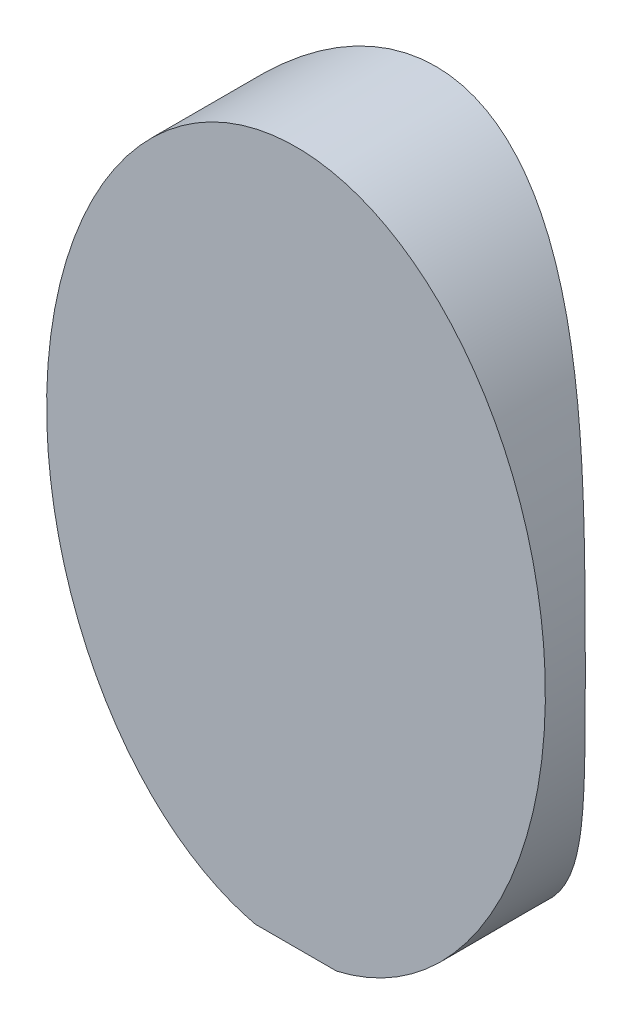
ISO-10303-21;
HEADER;
FILE_DESCRIPTION(('STEP AP214'),'2;1');
FILE_NAME('part.step','',(''),(''),'','','');
FILE_SCHEMA(('AUTOMOTIVE_DESIGN { 1 0 10303 214 1 1 1 1 }'));
ENDSEC;
DATA;
#1=APPLICATION_CONTEXT('core data for automotive mechanical design processes');
#2=APPLICATION_PROTOCOL_DEFINITION('international standard','automotive_design',2000,#1);
#3=PRODUCT_CONTEXT('',#1,'mechanical');
#4=PRODUCT('Part','Part','',(#3));
#5=PRODUCT_RELATED_PRODUCT_CATEGORY('part','',(#4));
#6=PRODUCT_DEFINITION_FORMATION('','',#4);
#7=PRODUCT_DEFINITION_CONTEXT('part definition',#1,'design');
#8=PRODUCT_DEFINITION('design','',#6,#7);
#9=PRODUCT_DEFINITION_SHAPE('','',#8);
#10=(LENGTH_UNIT() NAMED_UNIT(*) SI_UNIT(.MILLI.,.METRE.));
#11=(NAMED_UNIT(*) PLANE_ANGLE_UNIT() SI_UNIT($,.RADIAN.));
#12=(NAMED_UNIT(*) SI_UNIT($,.STERADIAN.) SOLID_ANGLE_UNIT());
#13=UNCERTAINTY_MEASURE_WITH_UNIT(LENGTH_MEASURE(1.E-05),#10,'distance_accuracy_value','');
#14=(GEOMETRIC_REPRESENTATION_CONTEXT(3) GLOBAL_UNCERTAINTY_ASSIGNED_CONTEXT((#13)) GLOBAL_UNIT_ASSIGNED_CONTEXT((#10,
#11,#12)) REPRESENTATION_CONTEXT('',''));
#15=CARTESIAN_POINT('',(0.,0.,0.));
#16=DIRECTION('',(0.,0.,1.));
#17=DIRECTION('',(1.,0.,0.));
#18=AXIS2_PLACEMENT_3D('',#15,#16,#17);
#19=CARTESIAN_POINT('',(0.,0.,0.3));
#20=DIRECTION('',(0.,0.,1.));
#21=DIRECTION('',(0.,1.,0.));
#22=AXIS2_PLACEMENT_3D('',#19,#20,#21);
#23=ELLIPSE('',#22,0.7,0.5);
#24=DIRECTION('',(0.,0.,-1.));
#25=VECTOR('',#24,1.);
#26=SURFACE_OF_LINEAR_EXTRUSION('',#23,#25);
#27=DIRECTION('',(0.,0.,-1.));
#28=VECTOR('',#27,1.);
#29=CARTESIAN_POINT('',(0.0814909660568855,-0.690640337660773,0.3));
#30=LINE('',#29,#28);
#31=CARTESIAN_POINT('',(0.0814909660568855,-0.690640337660773,0.3));
#32=VERTEX_POINT('',#31);
#33=CARTESIAN_POINT('',(0.0814909660568855,-0.690640337660773,0.0245944042061337));
#34=VERTEX_POINT('',#33);
#35=EDGE_CURVE('E51',#32,#34,#30,.T.);
#36=ORIENTED_EDGE('',*,*,#35,.T.);
#37=CARTESIAN_POINT('',(0.0814909660568855,-0.690640337660773,0.0245944042061337));
#38=CARTESIAN_POINT('',(0.1037838579656,-0.685503867180913,0.0271027590104672));
#39=CARTESIAN_POINT('',(0.125357213632184,-0.678326748241472,0.0306029288226713));
#40=CARTESIAN_POINT('',(0.166582420436828,-0.6606847828203,0.0390902771562346));
#41=CARTESIAN_POINT('',(0.186249843571142,-0.650250164964634,0.044063762896687));
#42=CARTESIAN_POINT('',(0.22887583197769,-0.623446553073999,0.0566188336295993));
#43=CARTESIAN_POINT('',(0.251191271496423,-0.606233831020013,0.0645402056819041));
#44=CARTESIAN_POINT('',(0.297684870257634,-0.564062746469057,0.0833474022579252));
#45=CARTESIAN_POINT('',(0.320963247320528,-0.538241212492798,0.0944823338410429));
#46=CARTESIAN_POINT('',(0.362863556927269,-0.48326090169533,0.116893052002176));
#47=CARTESIAN_POINT('',(0.381491712316841,-0.454106661689653,0.128168628911037));
#48=CARTESIAN_POINT('',(0.414538443906358,-0.393253086741298,0.149875929915907));
#49=CARTESIAN_POINT('',(0.428959264261967,-0.36155512014734,0.16030810172221));
#50=CARTESIAN_POINT('',(0.45382664469489,-0.296130607545835,0.179392355137647));
#51=CARTESIAN_POINT('',(0.464273383360248,-0.262404152773776,0.188044516729194));
#52=CARTESIAN_POINT('',(0.481342088482893,-0.192997251501916,0.202723287289175));
#53=CARTESIAN_POINT('',(0.487918639503869,-0.157298780230546,0.20871852412433));
#54=CARTESIAN_POINT('',(0.496993890713454,-0.0849752885129539,0.217116400756199));
#55=CARTESIAN_POINT('',(0.499494395364313,-0.0483506853608506,0.219520630249312));
#56=CARTESIAN_POINT('',(0.500418497746685,0.0293734420000636,0.220396172554828));
#57=CARTESIAN_POINT('',(0.498321571440296,0.0704868748823548,0.218365458179445));
#58=CARTESIAN_POINT('',(0.489016886643434,0.151591997118908,0.209719869460394));
#59=CARTESIAN_POINT('',(0.481810995186068,0.191584090709828,0.203106669771718));
#60=CARTESIAN_POINT('',(0.462388418320221,0.269540008140134,0.186444572292886));
#61=CARTESIAN_POINT('',(0.450173970770567,0.30750472927271,0.176397209244876));
#62=CARTESIAN_POINT('',(0.420643489773036,0.380744369990572,0.154216336465146));
#63=CARTESIAN_POINT('',(0.403327651117408,0.416019392214978,0.142082906395474));
#64=CARTESIAN_POINT('',(0.36423206397941,0.481351759849967,0.117732795174773));
#65=CARTESIAN_POINT('',(0.34272648098127,0.511583835764478,0.105552230495366));
#66=CARTESIAN_POINT('',(0.298956077656204,0.562209553010519,0.0841509979119887));
#67=CARTESIAN_POINT('',(0.277653243988022,0.583372924022462,0.074815570779179));
#68=CARTESIAN_POINT('',(0.234962351036348,0.618707628139722,0.0588139690807556));
#69=CARTESIAN_POINT('',(0.214129853270971,0.633455790493491,0.0519595451662675));
#70=CARTESIAN_POINT('',(0.1698414883734,0.659227234784342,0.0398036997819779));
#71=CARTESIAN_POINT('',(0.146390568021109,0.670257387509143,0.0344994161328848));
#72=CARTESIAN_POINT('',(0.104471203401553,0.685012668395196,0.0273482338127042));
#73=CARTESIAN_POINT('',(0.0865161494572823,0.68992711727926,0.0249454153233003));
#74=CARTESIAN_POINT('',(0.0499446251320577,0.696976549027224,0.0214900869141016));
#75=CARTESIAN_POINT('',(0.0313288157981923,0.699114233609243,0.0204362644714054));
#76=CARTESIAN_POINT('',(-0.00607590664155652,0.700439299878458,0.0197836514006045));
#77=CARTESIAN_POINT('',(-0.0248651116473994,0.699620142409139,0.020188085754722));
#78=CARTESIAN_POINT('',(-0.0620055286467893,0.695087298138191,0.0224164975548963));
#79=CARTESIAN_POINT('',(-0.080356531192159,0.691372254639459,0.0242411403555106));
#80=CARTESIAN_POINT('',(-0.115789842997178,0.681432301006925,0.0290867671040274));
#81=CARTESIAN_POINT('',(-0.132889966464228,0.675257999541097,0.0320836074871571));
#82=CARTESIAN_POINT('',(-0.165965622542596,0.660759689993981,0.0390487664566565));
#83=CARTESIAN_POINT('',(-0.181938741818942,0.652431236873029,0.0430190929157862));
#84=CARTESIAN_POINT('',(-0.221212455655061,0.628822576143696,0.054124443467678));
#85=CARTESIAN_POINT('',(-0.243596490019039,0.612263618028452,0.0617852937389163));
#86=CARTESIAN_POINT('',(-0.285196069589322,0.575987927278805,0.0780745522610286));
#87=CARTESIAN_POINT('',(-0.304406285192341,0.556265990494288,0.0867045479388135));
#88=CARTESIAN_POINT('',(-0.347673040755997,0.505241915974102,0.108162639144503));
#89=CARTESIAN_POINT('',(-0.370137074882207,0.47266543252372,0.121165499732847));
#90=CARTESIAN_POINT('',(-0.40952068883803,0.404022764809989,0.146282346283982));
#91=CARTESIAN_POINT('',(-0.426432659795867,0.367951878508429,0.158395094897575));
#92=CARTESIAN_POINT('',(-0.455458174049558,0.292084176418069,0.180618892583213));
#93=CARTESIAN_POINT('',(-0.467424601724881,0.252211462753406,0.190664630560296));
#94=CARTESIAN_POINT('',(-0.485911399663204,0.170464447659869,0.206792251515691));
#95=CARTESIAN_POINT('',(-0.492436918009739,0.128592078028532,0.212877880273002));
#96=CARTESIAN_POINT('',(-0.500052269132576,0.0426770955102942,0.220019744378044));
#97=CARTESIAN_POINT('',(-0.500980146785784,-0.00139328997805499,0.220926090296636));
#98=CARTESIAN_POINT('',(-0.496932019567044,-0.0890266590628147,0.217089448792668));
#99=CARTESIAN_POINT('',(-0.491952320277482,-0.132589307924755,0.212342926232133));
#100=CARTESIAN_POINT('',(-0.476826447597068,-0.214524022281717,0.198783128923104));
#101=CARTESIAN_POINT('',(-0.467110864732639,-0.253036636242351,0.190313762281496));
#102=CARTESIAN_POINT('',(-0.44276717486942,-0.327789526033037,0.17069467313972));
#103=CARTESIAN_POINT('',(-0.428135125978374,-0.364027950721574,0.15954280192332));
#104=CARTESIAN_POINT('',(-0.39489129432658,-0.43118117777007,0.136669387369934));
#105=CARTESIAN_POINT('',(-0.376610649348076,-0.462289893540877,0.125035660402943));
#106=CARTESIAN_POINT('',(-0.335171755178363,-0.521070159887528,0.101688514722108));
#107=CARTESIAN_POINT('',(-0.312021115516762,-0.54874696693516,0.0899752476054086));
#108=CARTESIAN_POINT('',(-0.26951702493666,-0.590286596747228,0.0717129803673023));
#109=CARTESIAN_POINT('',(-0.251712703679949,-0.605574802402189,0.0648017512212134));
#110=CARTESIAN_POINT('',(-0.213840367370047,-0.633453168015929,0.0519683462887412));
#111=CARTESIAN_POINT('',(-0.193781665638109,-0.646053847363464,0.046042335085624));
#112=CARTESIAN_POINT('',(-0.144118882267652,-0.671648984828261,0.0338566099810541));
#113=CARTESIAN_POINT('',(-0.113640546694371,-0.683220099863175,0.0282139964916989));
#114=CARTESIAN_POINT('',(-0.0814909660568869,-0.690640337660773,0.0245944042061339));
#115=B_SPLINE_CURVE_WITH_KNOTS('',3,(#37,#38,#39,#40,#41,#42,#43,#44,#45,#46,#47,#48,#49,#50,
#51,#52,#53,#54,#55,#56,#57,#58,#59,#60,#61,#62,#63,#64,#65,#66,#67,#68,#69,#70,#71,#72,#73,#74,
#75,#76,#77,#78,#79,#80,#81,#82,#83,#84,#85,#86,#87,#88,#89,#90,#91,#92,#93,#94,#95,#96,#97,#98,
#99,#100,#101,#102,#103,#104,#105,#106,#107,#108,#109,#110,#111,#112,#113,#114),.UNSPECIFIED.,
.F.,.F.,(4,2,2,2,2,2,2,2,2,2,2,2,2,2,2,2,2,2,2,2,2,2,2,2,2,2,2,2,2,2,2,2,2,2,2,2,2,2,4),(0.,
0.0687272270019127,0.136834747800037,0.224211264465826,0.333154812622204,0.441951783350591,
0.550690616186546,0.659424561918631,0.769410257987005,0.879347250245142,1.0023658614198,
1.12533953951957,1.24825833186399,1.37117243126779,1.48778897652579,1.58171397691671,
1.6606576856038,1.73945469810226,1.79552834513752,1.85154739303183,1.90769040477987,
1.96385973485426,2.01892839754204,2.07411161244408,2.16025364094591,2.24653888382911,
2.37083103782041,2.49529282479597,2.62322872210765,2.75104343112819,2.88253909056359,
3.01411702672295,3.13549148086101,3.2569634829596,3.37032115847212,3.48350300728094,
3.55668876276169,3.62958257593838,3.72814084618367),.UNSPECIFIED.);
#116=CARTESIAN_POINT('',(-0.0814909660568858,-0.690640337660773,0.0245944042061338));
#117=VERTEX_POINT('',#116);
#118=EDGE_CURVE('E57',#34,#117,#115,.T.);
#119=ORIENTED_EDGE('',*,*,#118,.T.);
#120=DIRECTION('',(0.,0.,-1.));
#121=VECTOR('',#120,1.);
#122=CARTESIAN_POINT('',(-0.0814909660568858,-0.690640337660773,0.3));
#123=LINE('',#122,#121);
#124=CARTESIAN_POINT('',(-0.0814909660568858,-0.690640337660773,0.3));
#125=VERTEX_POINT('',#124);
#126=EDGE_CURVE('E11',#125,#117,#123,.T.);
#127=ORIENTED_EDGE('',*,*,#126,.F.);
#128=EDGE_CURVE('E74',#32,#125,#23,.T.);
#129=ORIENTED_EDGE('',*,*,#128,.F.);
#130=EDGE_LOOP('',(#36,#119,#127,#129));
#131=FACE_BOUND('',#130,.T.);
#132=ADVANCED_FACE('F41',(#131),#26,.F.);
#133=CARTESIAN_POINT('',(-0.0814909660568858,-0.690640337660773,0.3));
#134=DIRECTION('',(0.,1.,0.));
#135=DIRECTION('',(0.,0.,1.));
#136=AXIS2_PLACEMENT_3D('',#133,#134,#135);
#137=PLANE('',#136);
#138=ORIENTED_EDGE('',*,*,#126,.T.);
#139=CARTESIAN_POINT('',(0.,-0.690640337660773,0.745));
#140=DIRECTION('',(0.,-1.,0.));
#141=DIRECTION('',(0.,0.,-1.));
#142=AXIS2_PLACEMENT_3D('',#139,#140,#141);
#143=CIRCLE('',#142,0.725);
#144=EDGE_CURVE('E75',#117,#34,#143,.T.);
#145=ORIENTED_EDGE('',*,*,#144,.T.);
#146=ORIENTED_EDGE('',*,*,#35,.F.);
#147=DIRECTION('',(1.,0.,0.));
#148=VECTOR('',#147,1.);
#149=CARTESIAN_POINT('',(-0.0814909660568858,-0.690640337660773,0.3));
#150=LINE('',#149,#148);
#151=EDGE_CURVE('E64',#125,#32,#150,.T.);
#152=ORIENTED_EDGE('',*,*,#151,.F.);
#153=EDGE_LOOP('',(#138,#145,#146,#152));
#154=FACE_BOUND('',#153,.T.);
#155=ADVANCED_FACE('F81',(#154),#137,.F.);
#156=CARTESIAN_POINT('',(0.,0.,0.3));
#157=DIRECTION('',(0.,0.,1.));
#158=DIRECTION('',(1.,0.,0.));
#159=AXIS2_PLACEMENT_3D('',#156,#157,#158);
#160=PLANE('',#159);
#161=ORIENTED_EDGE('',*,*,#128,.T.);
#162=ORIENTED_EDGE('',*,*,#151,.T.);
#163=EDGE_LOOP('',(#161,#162));
#164=FACE_BOUND('',#163,.T.);
#165=ADVANCED_FACE('F84',(#164),#160,.T.);
#166=CARTESIAN_POINT('',(0.,-0.690640337660773,0.745));
#167=DIRECTION('',(0.,1.,0.));
#168=DIRECTION('',(0.,0.,1.));
#169=AXIS2_PLACEMENT_3D('',#166,#167,#168);
#170=CYLINDRICAL_SURFACE('',#169,0.725);
#171=ORIENTED_EDGE('',*,*,#144,.F.);
#172=ORIENTED_EDGE('',*,*,#118,.F.);
#173=EDGE_LOOP('',(#171,#172));
#174=FACE_BOUND('',#173,.T.);
#175=ADVANCED_FACE('F77',(#174),#170,.T.);
#176=CLOSED_SHELL('',(#132,#155,#165,#175));
#177=MANIFOLD_SOLID_BREP('B2',#176);
#178=ADVANCED_BREP_SHAPE_REPRESENTATION('',(#18,#177),#14);
#179=SHAPE_DEFINITION_REPRESENTATION(#9,#178);
ENDSEC;
END-ISO-10303-21;
